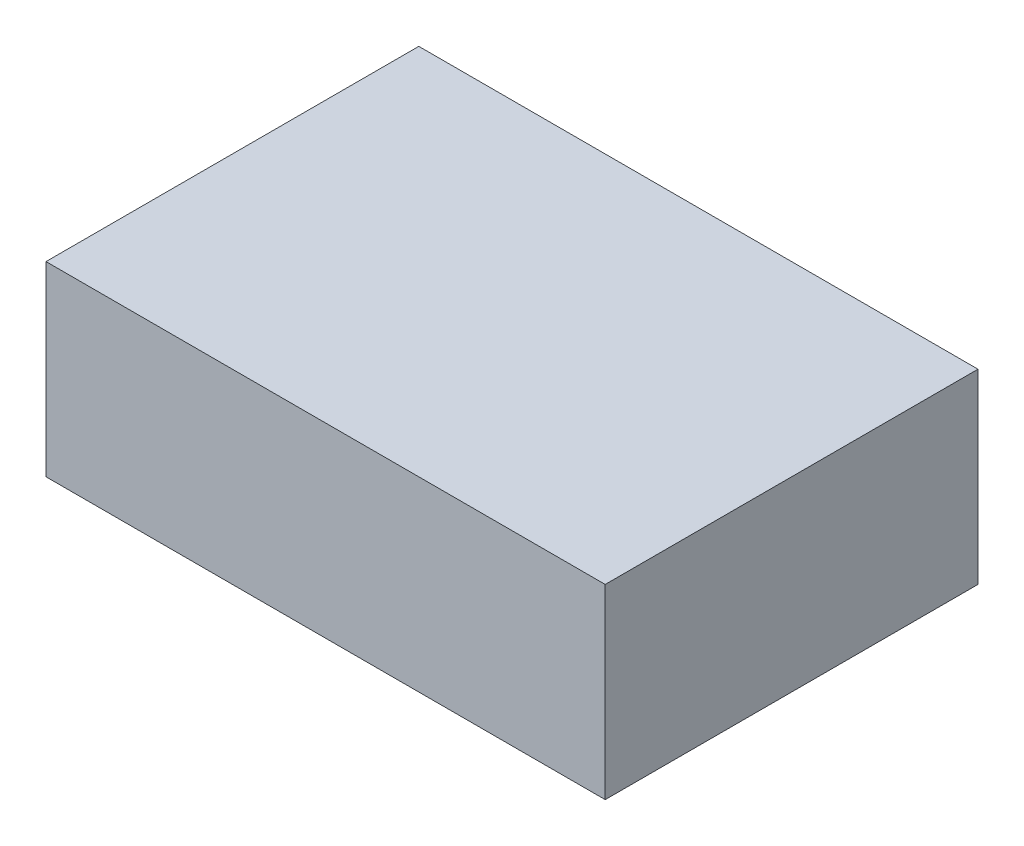
ISO-10303-21;
HEADER;
FILE_DESCRIPTION(('STEP AP214'),'2;1');
FILE_NAME('part.step','',(''),(''),'','','');
FILE_SCHEMA(('AUTOMOTIVE_DESIGN { 1 0 10303 214 1 1 1 1 }'));
ENDSEC;
DATA;
#1=APPLICATION_CONTEXT('core data for automotive mechanical design processes');
#2=APPLICATION_PROTOCOL_DEFINITION('international standard','automotive_design',2000,#1);
#3=PRODUCT_CONTEXT('',#1,'mechanical');
#4=PRODUCT('Part','Part','',(#3));
#5=PRODUCT_RELATED_PRODUCT_CATEGORY('part','',(#4));
#6=PRODUCT_DEFINITION_FORMATION('','',#4);
#7=PRODUCT_DEFINITION_CONTEXT('part definition',#1,'design');
#8=PRODUCT_DEFINITION('design','',#6,#7);
#9=PRODUCT_DEFINITION_SHAPE('','',#8);
#10=(LENGTH_UNIT() NAMED_UNIT(*) SI_UNIT(.MILLI.,.METRE.));
#11=(NAMED_UNIT(*) PLANE_ANGLE_UNIT() SI_UNIT($,.RADIAN.));
#12=(NAMED_UNIT(*) SI_UNIT($,.STERADIAN.) SOLID_ANGLE_UNIT());
#13=UNCERTAINTY_MEASURE_WITH_UNIT(LENGTH_MEASURE(1.E-05),#10,'distance_accuracy_value','');
#14=(GEOMETRIC_REPRESENTATION_CONTEXT(3) GLOBAL_UNCERTAINTY_ASSIGNED_CONTEXT((#13)) GLOBAL_UNIT_ASSIGNED_CONTEXT((#10,
#11,#12)) REPRESENTATION_CONTEXT('',''));
#15=CARTESIAN_POINT('',(0.,0.,0.));
#16=DIRECTION('',(0.,0.,1.));
#17=DIRECTION('',(1.,0.,0.));
#18=AXIS2_PLACEMENT_3D('',#15,#16,#17);
#19=CARTESIAN_POINT('',(30.,20.,20.));
#20=DIRECTION('',(-1.,0.,0.));
#21=DIRECTION('',(0.,0.,1.));
#22=AXIS2_PLACEMENT_3D('',#19,#20,#21);
#23=PLANE('',#22);
#24=DIRECTION('',(0.,0.,-1.));
#25=VECTOR('',#24,1.);
#26=CARTESIAN_POINT('',(30.,0.,20.));
#27=LINE('',#26,#25);
#28=CARTESIAN_POINT('',(30.,0.,20.));
#29=VERTEX_POINT('',#28);
#30=CARTESIAN_POINT('',(30.,0.,-20.));
#31=VERTEX_POINT('',#30);
#32=EDGE_CURVE('E96',#29,#31,#27,.T.);
#33=ORIENTED_EDGE('',*,*,#32,.T.);
#34=DIRECTION('',(0.,-1.,0.));
#35=VECTOR('',#34,1.);
#36=CARTESIAN_POINT('',(30.,20.,-20.));
#37=LINE('',#36,#35);
#38=CARTESIAN_POINT('',(30.,20.,-20.));
#39=VERTEX_POINT('',#38);
#40=EDGE_CURVE('E11',#39,#31,#37,.T.);
#41=ORIENTED_EDGE('',*,*,#40,.F.);
#42=DIRECTION('',(0.,0.,-1.));
#43=VECTOR('',#42,1.);
#44=CARTESIAN_POINT('',(30.,20.,20.));
#45=LINE('',#44,#43);
#46=CARTESIAN_POINT('',(30.,20.,20.));
#47=VERTEX_POINT('',#46);
#48=EDGE_CURVE('E84',#47,#39,#45,.T.);
#49=ORIENTED_EDGE('',*,*,#48,.F.);
#50=DIRECTION('',(0.,-1.,0.));
#51=VECTOR('',#50,1.);
#52=CARTESIAN_POINT('',(30.,20.,20.));
#53=LINE('',#52,#51);
#54=EDGE_CURVE('E92',#47,#29,#53,.T.);
#55=ORIENTED_EDGE('',*,*,#54,.T.);
#56=EDGE_LOOP('',(#33,#41,#49,#55));
#57=FACE_BOUND('',#56,.T.);
#58=ADVANCED_FACE('F33',(#57),#23,.F.);
#59=CARTESIAN_POINT('',(-30.,20.,-20.));
#60=DIRECTION('',(0.,0.,1.));
#61=DIRECTION('',(1.,0.,0.));
#62=AXIS2_PLACEMENT_3D('',#59,#60,#61);
#63=PLANE('',#62);
#64=DIRECTION('',(-1.,0.,0.));
#65=VECTOR('',#64,1.);
#66=CARTESIAN_POINT('',(-30.,0.,-20.));
#67=LINE('',#66,#65);
#68=CARTESIAN_POINT('',(-30.,0.,-20.));
#69=VERTEX_POINT('',#68);
#70=EDGE_CURVE('E88',#31,#69,#67,.T.);
#71=ORIENTED_EDGE('',*,*,#70,.T.);
#72=DIRECTION('',(0.,-1.,0.));
#73=VECTOR('',#72,1.);
#74=CARTESIAN_POINT('',(-30.,20.,-20.));
#75=LINE('',#74,#73);
#76=CARTESIAN_POINT('',(-30.,20.,-20.));
#77=VERTEX_POINT('',#76);
#78=EDGE_CURVE('E41',#77,#69,#75,.T.);
#79=ORIENTED_EDGE('',*,*,#78,.F.);
#80=DIRECTION('',(-1.,0.,0.));
#81=VECTOR('',#80,1.);
#82=CARTESIAN_POINT('',(-30.,20.,-20.));
#83=LINE('',#82,#81);
#84=EDGE_CURVE('E79',#39,#77,#83,.T.);
#85=ORIENTED_EDGE('',*,*,#84,.F.);
#86=ORIENTED_EDGE('',*,*,#40,.T.);
#87=EDGE_LOOP('',(#71,#79,#85,#86));
#88=FACE_BOUND('',#87,.T.);
#89=ADVANCED_FACE('F87',(#88),#63,.F.);
#90=CARTESIAN_POINT('',(-30.,20.,20.));
#91=DIRECTION('',(1.,0.,0.));
#92=DIRECTION('',(0.,0.,-1.));
#93=AXIS2_PLACEMENT_3D('',#90,#91,#92);
#94=PLANE('',#93);
#95=DIRECTION('',(0.,0.,1.));
#96=VECTOR('',#95,1.);
#97=CARTESIAN_POINT('',(-30.,0.,20.));
#98=LINE('',#97,#96);
#99=CARTESIAN_POINT('',(-30.,0.,20.));
#100=VERTEX_POINT('',#99);
#101=EDGE_CURVE('E66',#69,#100,#98,.T.);
#102=ORIENTED_EDGE('',*,*,#101,.T.);
#103=DIRECTION('',(0.,-1.,0.));
#104=VECTOR('',#103,1.);
#105=CARTESIAN_POINT('',(-30.,20.,20.));
#106=LINE('',#105,#104);
#107=CARTESIAN_POINT('',(-30.,20.,20.));
#108=VERTEX_POINT('',#107);
#109=EDGE_CURVE('E89',#108,#100,#106,.T.);
#110=ORIENTED_EDGE('',*,*,#109,.F.);
#111=DIRECTION('',(0.,0.,1.));
#112=VECTOR('',#111,1.);
#113=CARTESIAN_POINT('',(-30.,20.,20.));
#114=LINE('',#113,#112);
#115=EDGE_CURVE('E82',#77,#108,#114,.T.);
#116=ORIENTED_EDGE('',*,*,#115,.F.);
#117=ORIENTED_EDGE('',*,*,#78,.T.);
#118=EDGE_LOOP('',(#102,#110,#116,#117));
#119=FACE_BOUND('',#118,.T.);
#120=ADVANCED_FACE('F90',(#119),#94,.F.);
#121=CARTESIAN_POINT('',(-30.,20.,20.));
#122=DIRECTION('',(0.,0.,-1.));
#123=DIRECTION('',(-1.,0.,0.));
#124=AXIS2_PLACEMENT_3D('',#121,#122,#123);
#125=PLANE('',#124);
#126=DIRECTION('',(1.,0.,0.));
#127=VECTOR('',#126,1.);
#128=CARTESIAN_POINT('',(-30.,0.,20.));
#129=LINE('',#128,#127);
#130=EDGE_CURVE('E72',#100,#29,#129,.T.);
#131=ORIENTED_EDGE('',*,*,#130,.T.);
#132=ORIENTED_EDGE('',*,*,#54,.F.);
#133=DIRECTION('',(1.,0.,0.));
#134=VECTOR('',#133,1.);
#135=CARTESIAN_POINT('',(-30.,20.,20.));
#136=LINE('',#135,#134);
#137=EDGE_CURVE('E49',#108,#47,#136,.T.);
#138=ORIENTED_EDGE('',*,*,#137,.F.);
#139=ORIENTED_EDGE('',*,*,#109,.T.);
#140=EDGE_LOOP('',(#131,#132,#138,#139));
#141=FACE_BOUND('',#140,.T.);
#142=ADVANCED_FACE('F103',(#141),#125,.F.);
#143=CARTESIAN_POINT('',(0.,20.,0.));
#144=DIRECTION('',(0.,-1.,0.));
#145=DIRECTION('',(0.,0.,-1.));
#146=AXIS2_PLACEMENT_3D('',#143,#144,#145);
#147=PLANE('',#146);
#148=ORIENTED_EDGE('',*,*,#48,.T.);
#149=ORIENTED_EDGE('',*,*,#84,.T.);
#150=ORIENTED_EDGE('',*,*,#115,.T.);
#151=ORIENTED_EDGE('',*,*,#137,.T.);
#152=EDGE_LOOP('',(#148,#149,#150,#151));
#153=FACE_BOUND('',#152,.T.);
#154=ADVANCED_FACE('F80',(#153),#147,.F.);
#155=CARTESIAN_POINT('',(0.,0.,0.));
#156=DIRECTION('',(0.,-1.,0.));
#157=DIRECTION('',(0.,0.,-1.));
#158=AXIS2_PLACEMENT_3D('',#155,#156,#157);
#159=PLANE('',#158);
#160=ORIENTED_EDGE('',*,*,#32,.F.);
#161=ORIENTED_EDGE('',*,*,#130,.F.);
#162=ORIENTED_EDGE('',*,*,#101,.F.);
#163=ORIENTED_EDGE('',*,*,#70,.F.);
#164=EDGE_LOOP('',(#160,#161,#162,#163));
#165=FACE_BOUND('',#164,.T.);
#166=ADVANCED_FACE('F106',(#165),#159,.T.);
#167=CLOSED_SHELL('',(#58,#89,#120,#142,#154,#166));
#168=MANIFOLD_SOLID_BREP('B2',#167);
#169=ADVANCED_BREP_SHAPE_REPRESENTATION('',(#18,#168),#14);
#170=SHAPE_DEFINITION_REPRESENTATION(#9,#169);
ENDSEC;
END-ISO-10303-21;
